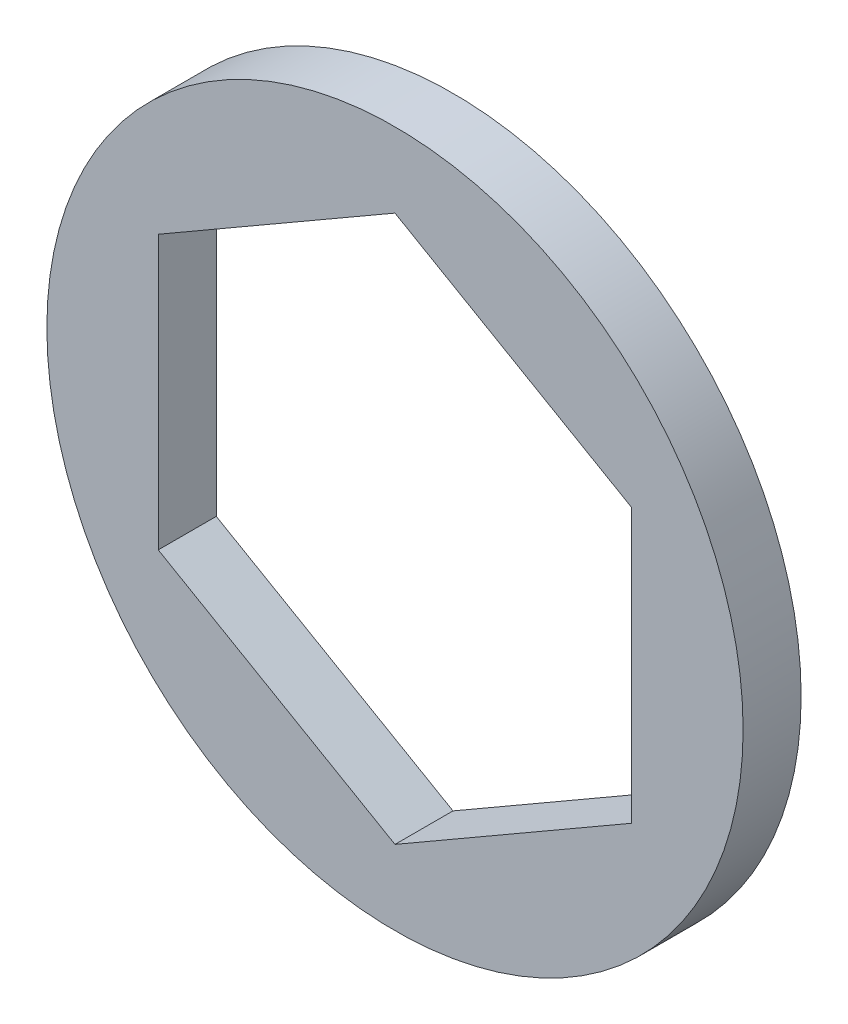
ISO-10303-21;
HEADER;
FILE_DESCRIPTION(('STEP AP214'),'2;1');
FILE_NAME('part.step','',(''),(''),'','','');
FILE_SCHEMA(('AUTOMOTIVE_DESIGN { 1 0 10303 214 1 1 1 1 }'));
ENDSEC;
DATA;
#1=APPLICATION_CONTEXT('core data for automotive mechanical design processes');
#2=APPLICATION_PROTOCOL_DEFINITION('international standard','automotive_design',2000,#1);
#3=PRODUCT_CONTEXT('',#1,'mechanical');
#4=PRODUCT('Part','Part','',(#3));
#5=PRODUCT_RELATED_PRODUCT_CATEGORY('part','',(#4));
#6=PRODUCT_DEFINITION_FORMATION('','',#4);
#7=PRODUCT_DEFINITION_CONTEXT('part definition',#1,'design');
#8=PRODUCT_DEFINITION('design','',#6,#7);
#9=PRODUCT_DEFINITION_SHAPE('','',#8);
#10=(LENGTH_UNIT() NAMED_UNIT(*) SI_UNIT(.MILLI.,.METRE.));
#11=(NAMED_UNIT(*) PLANE_ANGLE_UNIT() SI_UNIT($,.RADIAN.));
#12=(NAMED_UNIT(*) SI_UNIT($,.STERADIAN.) SOLID_ANGLE_UNIT());
#13=UNCERTAINTY_MEASURE_WITH_UNIT(LENGTH_MEASURE(1.E-05),#10,'distance_accuracy_value','');
#14=(GEOMETRIC_REPRESENTATION_CONTEXT(3) GLOBAL_UNCERTAINTY_ASSIGNED_CONTEXT((#13)) GLOBAL_UNIT_ASSIGNED_CONTEXT((#10,
#11,#12)) REPRESENTATION_CONTEXT('',''));
#15=CARTESIAN_POINT('',(0.,0.,0.));
#16=DIRECTION('',(0.,0.,1.));
#17=DIRECTION('',(1.,0.,0.));
#18=AXIS2_PLACEMENT_3D('',#15,#16,#17);
#19=CARTESIAN_POINT('',(0.,0.,0.79375));
#20=DIRECTION('',(0.,0.,1.));
#21=DIRECTION('',(1.,0.,0.));
#22=AXIS2_PLACEMENT_3D('',#19,#20,#21);
#23=PLANE('',#22);
#24=CARTESIAN_POINT('',(0.,0.,0.79375));
#25=DIRECTION('',(0.,0.,1.));
#26=DIRECTION('',(1.,0.,0.));
#27=AXIS2_PLACEMENT_3D('',#24,#25,#26);
#28=CIRCLE('',#27,9.525);
#29=CARTESIAN_POINT('',(9.525,0.,0.79375));
#30=VERTEX_POINT('',#29);
#31=EDGE_CURVE('E11',#30,#30,#28,.T.);
#32=ORIENTED_EDGE('',*,*,#31,.T.);
#33=EDGE_LOOP('',(#32));
#34=FACE_BOUND('',#33,.T.);
#35=DIRECTION('',(-0.866025403784439,-0.5,0.));
#36=VECTOR('',#35,1.);
#37=CARTESIAN_POINT('',(0.,7.47899538708241,0.79375));
#38=LINE('',#37,#36);
#39=CARTESIAN_POINT('',(0.,7.47899538708241,0.79375));
#40=VERTEX_POINT('',#39);
#41=CARTESIAN_POINT('',(-6.477,3.73949769354121,0.79375));
#42=VERTEX_POINT('',#41);
#43=EDGE_CURVE('E102',#40,#42,#38,.T.);
#44=ORIENTED_EDGE('',*,*,#43,.F.);
#45=DIRECTION('',(-0.866025403784439,0.5,0.));
#46=VECTOR('',#45,1.);
#47=CARTESIAN_POINT('',(6.477,3.73949769354121,0.79375));
#48=LINE('',#47,#46);
#49=CARTESIAN_POINT('',(6.477,3.73949769354121,0.79375));
#50=VERTEX_POINT('',#49);
#51=EDGE_CURVE('E94',#50,#40,#48,.T.);
#52=ORIENTED_EDGE('',*,*,#51,.F.);
#53=DIRECTION('',(0.,1.,0.));
#54=VECTOR('',#53,1.);
#55=CARTESIAN_POINT('',(6.477,-3.73949769354121,0.79375));
#56=LINE('',#55,#54);
#57=CARTESIAN_POINT('',(6.477,-3.73949769354121,0.79375));
#58=VERTEX_POINT('',#57);
#59=EDGE_CURVE('E122',#58,#50,#56,.T.);
#60=ORIENTED_EDGE('',*,*,#59,.F.);
#61=DIRECTION('',(0.866025403784439,0.5,0.));
#62=VECTOR('',#61,1.);
#63=CARTESIAN_POINT('',(0.,-7.47899538708241,0.79375));
#64=LINE('',#63,#62);
#65=CARTESIAN_POINT('',(0.,-7.47899538708241,0.79375));
#66=VERTEX_POINT('',#65);
#67=EDGE_CURVE('E120',#66,#58,#64,.T.);
#68=ORIENTED_EDGE('',*,*,#67,.F.);
#69=DIRECTION('',(0.866025403784438,-0.5,0.));
#70=VECTOR('',#69,1.);
#71=CARTESIAN_POINT('',(-6.477,-3.73949769354121,0.79375));
#72=LINE('',#71,#70);
#73=CARTESIAN_POINT('',(-6.477,-3.73949769354121,0.79375));
#74=VERTEX_POINT('',#73);
#75=EDGE_CURVE('E116',#74,#66,#72,.T.);
#76=ORIENTED_EDGE('',*,*,#75,.F.);
#77=DIRECTION('',(0.,-1.,0.));
#78=VECTOR('',#77,1.);
#79=CARTESIAN_POINT('',(-6.477,3.73949769354121,0.79375));
#80=LINE('',#79,#78);
#81=EDGE_CURVE('E114',#42,#74,#80,.T.);
#82=ORIENTED_EDGE('',*,*,#81,.F.);
#83=EDGE_LOOP('',(#44,#52,#60,#68,#76,#82));
#84=FACE_BOUND('',#83,.T.);
#85=ADVANCED_FACE('F41',(#34,#84),#23,.T.);
#86=CARTESIAN_POINT('',(0.,0.,-0.79375));
#87=DIRECTION('',(0.,0.,1.));
#88=DIRECTION('',(1.,0.,0.));
#89=AXIS2_PLACEMENT_3D('',#86,#87,#88);
#90=PLANE('',#89);
#91=CARTESIAN_POINT('',(0.,0.,-0.79375));
#92=DIRECTION('',(0.,0.,1.));
#93=DIRECTION('',(1.,0.,0.));
#94=AXIS2_PLACEMENT_3D('',#91,#92,#93);
#95=CIRCLE('',#94,9.525);
#96=CARTESIAN_POINT('',(9.525,0.,-0.79375));
#97=VERTEX_POINT('',#96);
#98=EDGE_CURVE('E45',#97,#97,#95,.T.);
#99=ORIENTED_EDGE('',*,*,#98,.F.);
#100=EDGE_LOOP('',(#99));
#101=FACE_BOUND('',#100,.T.);
#102=DIRECTION('',(-0.866025403784439,0.5,0.));
#103=VECTOR('',#102,1.);
#104=CARTESIAN_POINT('',(6.477,3.73949769354121,-0.79375));
#105=LINE('',#104,#103);
#106=CARTESIAN_POINT('',(6.477,3.73949769354121,-0.79375));
#107=VERTEX_POINT('',#106);
#108=CARTESIAN_POINT('',(0.,7.47899538708241,-0.79375));
#109=VERTEX_POINT('',#108);
#110=EDGE_CURVE('E64',#107,#109,#105,.T.);
#111=ORIENTED_EDGE('',*,*,#110,.T.);
#112=DIRECTION('',(-0.866025403784439,-0.5,0.));
#113=VECTOR('',#112,1.);
#114=CARTESIAN_POINT('',(0.,7.47899538708241,-0.79375));
#115=LINE('',#114,#113);
#116=CARTESIAN_POINT('',(-6.477,3.73949769354121,-0.79375));
#117=VERTEX_POINT('',#116);
#118=EDGE_CURVE('E109',#109,#117,#115,.T.);
#119=ORIENTED_EDGE('',*,*,#118,.T.);
#120=DIRECTION('',(0.,-1.,0.));
#121=VECTOR('',#120,1.);
#122=CARTESIAN_POINT('',(-6.477,3.73949769354121,-0.79375));
#123=LINE('',#122,#121);
#124=CARTESIAN_POINT('',(-6.477,-3.73949769354121,-0.79375));
#125=VERTEX_POINT('',#124);
#126=EDGE_CURVE('E126',#117,#125,#123,.T.);
#127=ORIENTED_EDGE('',*,*,#126,.T.);
#128=DIRECTION('',(0.866025403784438,-0.5,0.));
#129=VECTOR('',#128,1.);
#130=CARTESIAN_POINT('',(-6.477,-3.73949769354121,-0.79375));
#131=LINE('',#130,#129);
#132=CARTESIAN_POINT('',(0.,-7.47899538708241,-0.79375));
#133=VERTEX_POINT('',#132);
#134=EDGE_CURVE('E129',#125,#133,#131,.T.);
#135=ORIENTED_EDGE('',*,*,#134,.T.);
#136=DIRECTION('',(0.866025403784439,0.5,0.));
#137=VECTOR('',#136,1.);
#138=CARTESIAN_POINT('',(0.,-7.47899538708241,-0.79375));
#139=LINE('',#138,#137);
#140=CARTESIAN_POINT('',(6.477,-3.73949769354121,-0.79375));
#141=VERTEX_POINT('',#140);
#142=EDGE_CURVE('E132',#133,#141,#139,.T.);
#143=ORIENTED_EDGE('',*,*,#142,.T.);
#144=DIRECTION('',(0.,1.,0.));
#145=VECTOR('',#144,1.);
#146=CARTESIAN_POINT('',(6.477,-3.73949769354121,-0.79375));
#147=LINE('',#146,#145);
#148=EDGE_CURVE('E103',#141,#107,#147,.T.);
#149=ORIENTED_EDGE('',*,*,#148,.T.);
#150=EDGE_LOOP('',(#111,#119,#127,#135,#143,#149));
#151=FACE_BOUND('',#150,.T.);
#152=ADVANCED_FACE('F149',(#101,#151),#90,.F.);
#153=CARTESIAN_POINT('',(0.,0.,0.79375));
#154=DIRECTION('',(0.,0.,-1.));
#155=DIRECTION('',(-1.,0.,0.));
#156=AXIS2_PLACEMENT_3D('',#153,#154,#155);
#157=CYLINDRICAL_SURFACE('',#156,9.525);
#158=ORIENTED_EDGE('',*,*,#31,.F.);
#159=EDGE_LOOP('',(#158));
#160=FACE_BOUND('',#159,.T.);
#161=ORIENTED_EDGE('',*,*,#98,.T.);
#162=EDGE_LOOP('',(#161));
#163=FACE_BOUND('',#162,.T.);
#164=ADVANCED_FACE('F43',(#160,#163),#157,.T.);
#165=CARTESIAN_POINT('',(6.477,3.73949769354121,0.79375));
#166=DIRECTION('',(-0.5,-0.866025403784439,0.));
#167=DIRECTION('',(0.866025403784439,-0.5,0.));
#168=AXIS2_PLACEMENT_3D('',#165,#166,#167);
#169=PLANE('',#168);
#170=ORIENTED_EDGE('',*,*,#110,.F.);
#171=DIRECTION('',(0.,0.,-1.));
#172=VECTOR('',#171,1.);
#173=CARTESIAN_POINT('',(6.477,3.73949769354121,0.79375));
#174=LINE('',#173,#172);
#175=EDGE_CURVE('E98',#50,#107,#174,.T.);
#176=ORIENTED_EDGE('',*,*,#175,.F.);
#177=ORIENTED_EDGE('',*,*,#51,.T.);
#178=DIRECTION('',(0.,0.,-1.));
#179=VECTOR('',#178,1.);
#180=CARTESIAN_POINT('',(0.,7.47899538708241,0.79375));
#181=LINE('',#180,#179);
#182=EDGE_CURVE('E97',#40,#109,#181,.T.);
#183=ORIENTED_EDGE('',*,*,#182,.T.);
#184=EDGE_LOOP('',(#170,#176,#177,#183));
#185=FACE_BOUND('',#184,.T.);
#186=ADVANCED_FACE('F96',(#185),#169,.T.);
#187=CARTESIAN_POINT('',(0.,7.47899538708241,0.79375));
#188=DIRECTION('',(0.5,-0.866025403784439,0.));
#189=DIRECTION('',(0.866025403784439,0.5,0.));
#190=AXIS2_PLACEMENT_3D('',#187,#188,#189);
#191=PLANE('',#190);
#192=ORIENTED_EDGE('',*,*,#118,.F.);
#193=ORIENTED_EDGE('',*,*,#182,.F.);
#194=ORIENTED_EDGE('',*,*,#43,.T.);
#195=DIRECTION('',(0.,0.,-1.));
#196=VECTOR('',#195,1.);
#197=CARTESIAN_POINT('',(-6.477,3.73949769354121,0.79375));
#198=LINE('',#197,#196);
#199=EDGE_CURVE('E110',#42,#117,#198,.T.);
#200=ORIENTED_EDGE('',*,*,#199,.T.);
#201=EDGE_LOOP('',(#192,#193,#194,#200));
#202=FACE_BOUND('',#201,.T.);
#203=ADVANCED_FACE('F106',(#202),#191,.T.);
#204=CARTESIAN_POINT('',(-6.477,3.73949769354121,0.79375));
#205=DIRECTION('',(1.,0.,0.));
#206=DIRECTION('',(0.,0.,-1.));
#207=AXIS2_PLACEMENT_3D('',#204,#205,#206);
#208=PLANE('',#207);
#209=ORIENTED_EDGE('',*,*,#126,.F.);
#210=ORIENTED_EDGE('',*,*,#199,.F.);
#211=ORIENTED_EDGE('',*,*,#81,.T.);
#212=DIRECTION('',(0.,0.,-1.));
#213=VECTOR('',#212,1.);
#214=CARTESIAN_POINT('',(-6.477,-3.73949769354121,0.79375));
#215=LINE('',#214,#213);
#216=EDGE_CURVE('E141',#74,#125,#215,.T.);
#217=ORIENTED_EDGE('',*,*,#216,.T.);
#218=EDGE_LOOP('',(#209,#210,#211,#217));
#219=FACE_BOUND('',#218,.T.);
#220=ADVANCED_FACE('F145',(#219),#208,.T.);
#221=CARTESIAN_POINT('',(-6.477,-3.73949769354121,0.79375));
#222=DIRECTION('',(0.5,0.866025403784438,0.));
#223=DIRECTION('',(-0.866025403784439,0.5,0.));
#224=AXIS2_PLACEMENT_3D('',#221,#222,#223);
#225=PLANE('',#224);
#226=ORIENTED_EDGE('',*,*,#134,.F.);
#227=ORIENTED_EDGE('',*,*,#216,.F.);
#228=ORIENTED_EDGE('',*,*,#75,.T.);
#229=DIRECTION('',(0.,0.,-1.));
#230=VECTOR('',#229,1.);
#231=CARTESIAN_POINT('',(0.,-7.47899538708241,0.79375));
#232=LINE('',#231,#230);
#233=EDGE_CURVE('E139',#66,#133,#232,.T.);
#234=ORIENTED_EDGE('',*,*,#233,.T.);
#235=EDGE_LOOP('',(#226,#227,#228,#234));
#236=FACE_BOUND('',#235,.T.);
#237=ADVANCED_FACE('F157',(#236),#225,.T.);
#238=CARTESIAN_POINT('',(0.,-7.47899538708241,0.79375));
#239=DIRECTION('',(-0.5,0.866025403784439,0.));
#240=DIRECTION('',(-0.866025403784439,-0.5,0.));
#241=AXIS2_PLACEMENT_3D('',#238,#239,#240);
#242=PLANE('',#241);
#243=ORIENTED_EDGE('',*,*,#142,.F.);
#244=ORIENTED_EDGE('',*,*,#233,.F.);
#245=ORIENTED_EDGE('',*,*,#67,.T.);
#246=DIRECTION('',(0.,0.,-1.));
#247=VECTOR('',#246,1.);
#248=CARTESIAN_POINT('',(6.477,-3.73949769354121,0.79375));
#249=LINE('',#248,#247);
#250=EDGE_CURVE('E56',#58,#141,#249,.T.);
#251=ORIENTED_EDGE('',*,*,#250,.T.);
#252=EDGE_LOOP('',(#243,#244,#245,#251));
#253=FACE_BOUND('',#252,.T.);
#254=ADVANCED_FACE('F155',(#253),#242,.T.);
#255=CARTESIAN_POINT('',(6.477,-3.73949769354121,0.79375));
#256=DIRECTION('',(-1.,0.,0.));
#257=DIRECTION('',(0.,-1.,0.));
#258=AXIS2_PLACEMENT_3D('',#255,#256,#257);
#259=PLANE('',#258);
#260=ORIENTED_EDGE('',*,*,#148,.F.);
#261=ORIENTED_EDGE('',*,*,#250,.F.);
#262=ORIENTED_EDGE('',*,*,#59,.T.);
#263=ORIENTED_EDGE('',*,*,#175,.T.);
#264=EDGE_LOOP('',(#260,#261,#262,#263));
#265=FACE_BOUND('',#264,.T.);
#266=ADVANCED_FACE('F151',(#265),#259,.T.);
#267=CLOSED_SHELL('',(#85,#152,#164,#186,#203,#220,#237,#254,#266));
#268=MANIFOLD_SOLID_BREP('B2',#267);
#269=ADVANCED_BREP_SHAPE_REPRESENTATION('',(#18,#268),#14);
#270=SHAPE_DEFINITION_REPRESENTATION(#9,#269);
ENDSEC;
END-ISO-10303-21;
